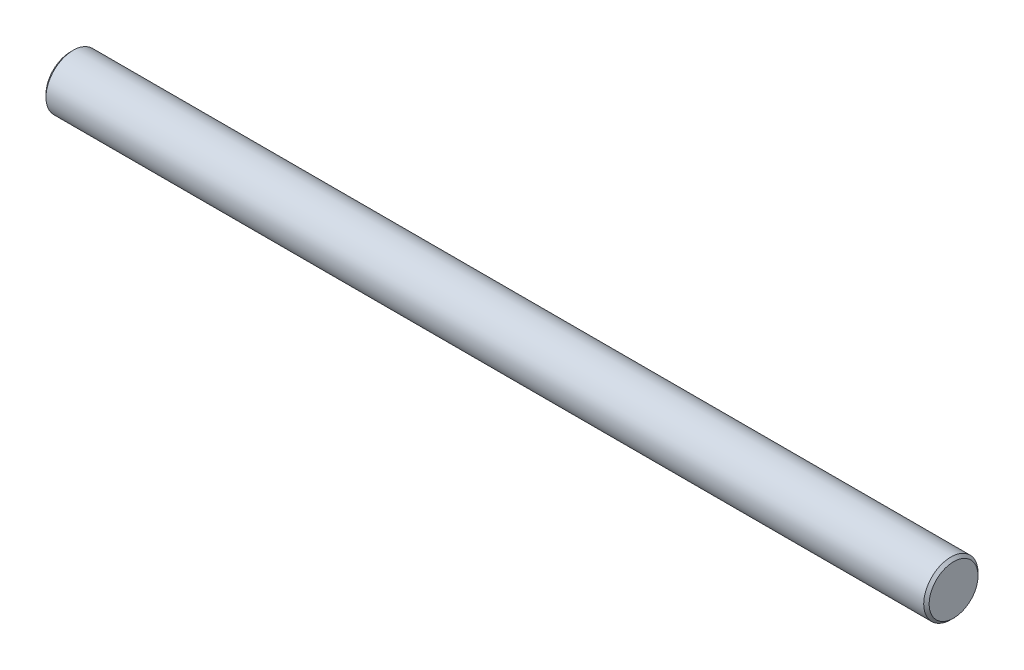
ISO-10303-21;
HEADER;
FILE_DESCRIPTION(('STEP AP214'),'2;1');
FILE_NAME('part.step','',(''),(''),'','','');
FILE_SCHEMA(('AUTOMOTIVE_DESIGN { 1 0 10303 214 1 1 1 1 }'));
ENDSEC;
DATA;
#1=APPLICATION_CONTEXT('core data for automotive mechanical design processes');
#2=APPLICATION_PROTOCOL_DEFINITION('international standard','automotive_design',2000,#1);
#3=PRODUCT_CONTEXT('',#1,'mechanical');
#4=PRODUCT('Part','Part','',(#3));
#5=PRODUCT_RELATED_PRODUCT_CATEGORY('part','',(#4));
#6=PRODUCT_DEFINITION_FORMATION('','',#4);
#7=PRODUCT_DEFINITION_CONTEXT('part definition',#1,'design');
#8=PRODUCT_DEFINITION('design','',#6,#7);
#9=PRODUCT_DEFINITION_SHAPE('','',#8);
#10=(LENGTH_UNIT() NAMED_UNIT(*) SI_UNIT(.MILLI.,.METRE.));
#11=(NAMED_UNIT(*) PLANE_ANGLE_UNIT() SI_UNIT($,.RADIAN.));
#12=(NAMED_UNIT(*) SI_UNIT($,.STERADIAN.) SOLID_ANGLE_UNIT());
#13=UNCERTAINTY_MEASURE_WITH_UNIT(LENGTH_MEASURE(1.E-05),#10,'distance_accuracy_value','');
#14=(GEOMETRIC_REPRESENTATION_CONTEXT(3) GLOBAL_UNCERTAINTY_ASSIGNED_CONTEXT((#13)) GLOBAL_UNIT_ASSIGNED_CONTEXT((#10,
#11,#12)) REPRESENTATION_CONTEXT('',''));
#15=CARTESIAN_POINT('',(0.,0.,0.));
#16=DIRECTION('',(0.,0.,1.));
#17=DIRECTION('',(1.,0.,0.));
#18=AXIS2_PLACEMENT_3D('',#15,#16,#17);
#19=CARTESIAN_POINT('',(65.,1.8,0.));
#20=DIRECTION('',(-1.,0.,0.));
#21=DIRECTION('',(0.,0.,1.));
#22=AXIS2_PLACEMENT_3D('',#19,#20,#21);
#23=PLANE('',#22);
#24=CARTESIAN_POINT('',(65.,0.,0.));
#25=DIRECTION('',(-1.,0.,0.));
#26=DIRECTION('',(0.,0.,1.));
#27=AXIS2_PLACEMENT_3D('',#24,#25,#26);
#28=CIRCLE('',#27,1.8);
#29=CARTESIAN_POINT('',(65.,0.,1.8));
#30=VERTEX_POINT('',#29);
#31=EDGE_CURVE('E11',#30,#30,#28,.T.);
#32=ORIENTED_EDGE('',*,*,#31,.F.);
#33=EDGE_LOOP('',(#32));
#34=FACE_BOUND('',#33,.T.);
#35=ADVANCED_FACE('F17',(#34),#23,.F.);
#36=CARTESIAN_POINT('',(65.,0.,0.));
#37=DIRECTION('',(-1.,0.,0.));
#38=DIRECTION('',(0.,0.,1.));
#39=AXIS2_PLACEMENT_3D('',#36,#37,#38);
#40=CONICAL_SURFACE('',#39,1.8,0.785398163397449);
#41=ORIENTED_EDGE('',*,*,#31,.T.);
#42=EDGE_LOOP('',(#41));
#43=FACE_BOUND('',#42,.T.);
#44=CARTESIAN_POINT('',(64.8,0.,0.));
#45=DIRECTION('',(-1.,0.,0.));
#46=DIRECTION('',(0.,0.,1.));
#47=AXIS2_PLACEMENT_3D('',#44,#45,#46);
#48=CIRCLE('',#47,2.);
#49=CARTESIAN_POINT('',(64.8,0.,2.));
#50=VERTEX_POINT('',#49);
#51=EDGE_CURVE('E25',#50,#50,#48,.T.);
#52=ORIENTED_EDGE('',*,*,#51,.F.);
#53=EDGE_LOOP('',(#52));
#54=FACE_BOUND('',#53,.T.);
#55=ADVANCED_FACE('F110',(#43,#54),#40,.T.);
#56=CARTESIAN_POINT('',(-1.25,0.,0.));
#57=DIRECTION('',(-1.,0.,0.));
#58=DIRECTION('',(0.,0.,1.));
#59=AXIS2_PLACEMENT_3D('',#56,#57,#58);
#60=CYLINDRICAL_SURFACE('',#59,2.);
#61=CARTESIAN_POINT('',(0.2,0.,0.));
#62=DIRECTION('',(-1.,0.,0.));
#63=DIRECTION('',(0.,0.,1.));
#64=AXIS2_PLACEMENT_3D('',#61,#62,#63);
#65=CIRCLE('',#64,2.);
#66=CARTESIAN_POINT('',(0.2,0.,2.));
#67=VERTEX_POINT('',#66);
#68=EDGE_CURVE('E57',#67,#67,#65,.T.);
#69=ORIENTED_EDGE('',*,*,#68,.F.);
#70=EDGE_LOOP('',(#69));
#71=FACE_BOUND('',#70,.T.);
#72=ORIENTED_EDGE('',*,*,#51,.T.);
#73=EDGE_LOOP('',(#72));
#74=FACE_BOUND('',#73,.T.);
#75=ADVANCED_FACE('F102',(#71,#74),#60,.T.);
#76=CARTESIAN_POINT('',(0.2,0.,0.));
#77=DIRECTION('',(1.,0.,0.));
#78=DIRECTION('',(0.,0.,-1.));
#79=AXIS2_PLACEMENT_3D('',#76,#77,#78);
#80=CONICAL_SURFACE('',#79,2.,0.78539816339745);
#81=CARTESIAN_POINT('',(0.,0.,0.));
#82=DIRECTION('',(-1.,0.,0.));
#83=DIRECTION('',(0.,0.,1.));
#84=AXIS2_PLACEMENT_3D('',#81,#82,#83);
#85=CIRCLE('',#84,1.8);
#86=CARTESIAN_POINT('',(0.,0.,1.8));
#87=VERTEX_POINT('',#86);
#88=EDGE_CURVE('E53',#87,#87,#85,.T.);
#89=ORIENTED_EDGE('',*,*,#88,.F.);
#90=EDGE_LOOP('',(#89));
#91=FACE_BOUND('',#90,.T.);
#92=ORIENTED_EDGE('',*,*,#68,.T.);
#93=EDGE_LOOP('',(#92));
#94=FACE_BOUND('',#93,.T.);
#95=ADVANCED_FACE('F95',(#91,#94),#80,.T.);
#96=CARTESIAN_POINT('',(0.,0.,0.));
#97=DIRECTION('',(1.,0.,0.));
#98=DIRECTION('',(0.,1.,0.));
#99=AXIS2_PLACEMENT_3D('',#96,#97,#98);
#100=PLANE('',#99);
#101=ORIENTED_EDGE('',*,*,#88,.T.);
#102=EDGE_LOOP('',(#101));
#103=FACE_BOUND('',#102,.T.);
#104=ADVANCED_FACE('F54',(#103),#100,.F.);
#105=CLOSED_SHELL('',(#35,#55,#75,#95,#104));
#106=MANIFOLD_SOLID_BREP('B1',#105);
#107=ADVANCED_BREP_SHAPE_REPRESENTATION('',(#18,#106),#14);
#108=SHAPE_DEFINITION_REPRESENTATION(#9,#107);
ENDSEC;
END-ISO-10303-21;
